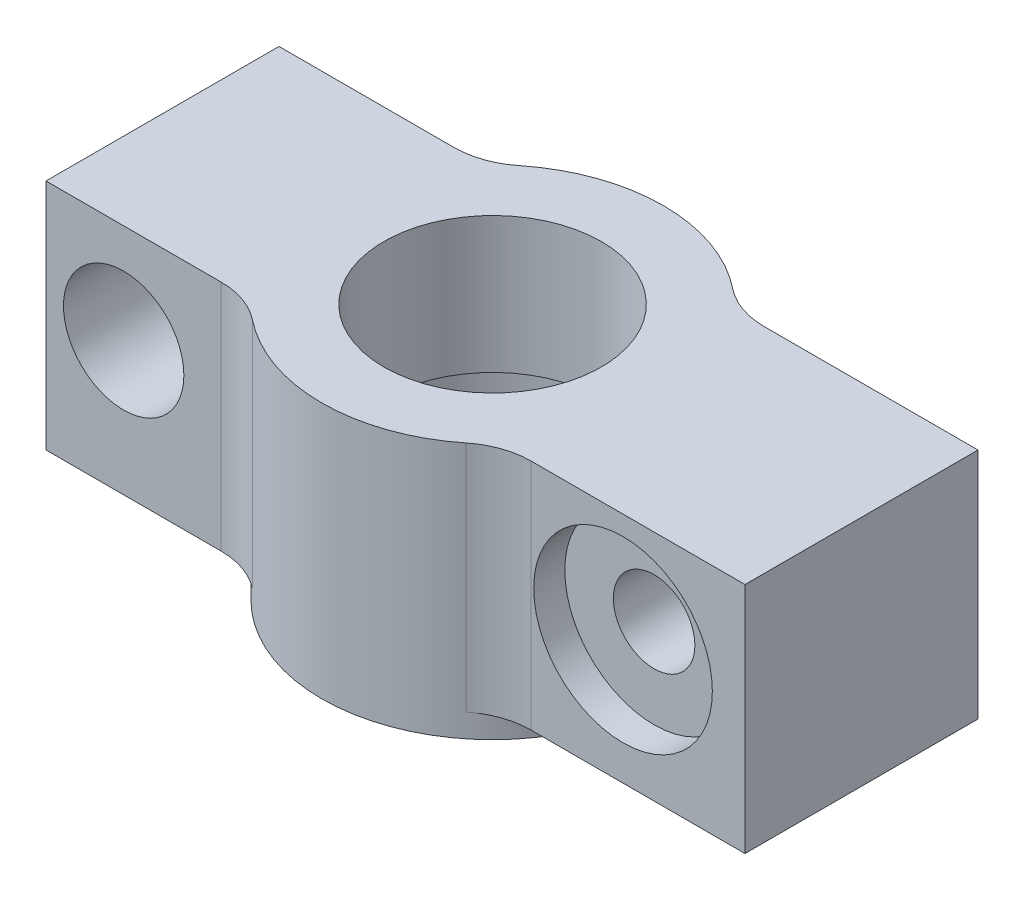
ISO-10303-21;
HEADER;
FILE_DESCRIPTION(('STEP AP214'),'2;1');
FILE_NAME('part.step','',(''),(''),'','','');
FILE_SCHEMA(('AUTOMOTIVE_DESIGN { 1 0 10303 214 1 1 1 1 }'));
ENDSEC;
DATA;
#1=APPLICATION_CONTEXT('core data for automotive mechanical design processes');
#2=APPLICATION_PROTOCOL_DEFINITION('international standard','automotive_design',2000,#1);
#3=PRODUCT_CONTEXT('',#1,'mechanical');
#4=PRODUCT('Part','Part','',(#3));
#5=PRODUCT_RELATED_PRODUCT_CATEGORY('part','',(#4));
#6=PRODUCT_DEFINITION_FORMATION('','',#4);
#7=PRODUCT_DEFINITION_CONTEXT('part definition',#1,'design');
#8=PRODUCT_DEFINITION('design','',#6,#7);
#9=PRODUCT_DEFINITION_SHAPE('','',#8);
#10=(LENGTH_UNIT() NAMED_UNIT(*) SI_UNIT(.MILLI.,.METRE.));
#11=(NAMED_UNIT(*) PLANE_ANGLE_UNIT() SI_UNIT($,.RADIAN.));
#12=(NAMED_UNIT(*) SI_UNIT($,.STERADIAN.) SOLID_ANGLE_UNIT());
#13=UNCERTAINTY_MEASURE_WITH_UNIT(LENGTH_MEASURE(1.E-05),#10,'distance_accuracy_value','');
#14=(GEOMETRIC_REPRESENTATION_CONTEXT(3) GLOBAL_UNCERTAINTY_ASSIGNED_CONTEXT((#13)) GLOBAL_UNIT_ASSIGNED_CONTEXT((#10,
#11,#12)) REPRESENTATION_CONTEXT('',''));
#15=CARTESIAN_POINT('',(0.,0.,0.));
#16=DIRECTION('',(0.,0.,1.));
#17=DIRECTION('',(1.,0.,0.));
#18=AXIS2_PLACEMENT_3D('',#15,#16,#17);
#19=CARTESIAN_POINT('',(0.,0.,0.));
#20=DIRECTION('',(0.,1.,0.));
#21=DIRECTION('',(0.,0.,1.));
#22=AXIS2_PLACEMENT_3D('',#19,#20,#21);
#23=PLANE('',#22);
#24=CARTESIAN_POINT('',(0.,0.,0.));
#25=DIRECTION('',(0.,-1.,0.));
#26=DIRECTION('',(0.,0.,-1.));
#27=AXIS2_PLACEMENT_3D('',#24,#25,#26);
#28=CIRCLE('',#27,22.);
#29=CARTESIAN_POINT('',(13.7328017443638,0.,-17.1875));
#30=VERTEX_POINT('',#29);
#31=CARTESIAN_POINT('',(13.7328017443638,0.,17.1875));
#32=VERTEX_POINT('',#31);
#33=EDGE_CURVE('E198',#30,#32,#28,.T.);
#34=ORIENTED_EDGE('',*,*,#33,.F.);
#35=CARTESIAN_POINT('',(19.9749843554382,0.,-25.));
#36=DIRECTION('',(0.,1.,0.));
#37=DIRECTION('',(0.,0.,1.));
#38=AXIS2_PLACEMENT_3D('',#35,#36,#37);
#39=CIRCLE('',#38,10.);
#40=CARTESIAN_POINT('',(19.9749843554382,0.,-15.));
#41=VERTEX_POINT('',#40);
#42=EDGE_CURVE('E333',#30,#41,#39,.T.);
#43=ORIENTED_EDGE('',*,*,#42,.T.);
#44=DIRECTION('',(-1.,0.,0.));
#45=VECTOR('',#44,1.);
#46=CARTESIAN_POINT('',(16.0934769394311,0.,-15.));
#47=LINE('',#46,#45);
#48=CARTESIAN_POINT('',(47.5,0.,-15.));
#49=VERTEX_POINT('',#48);
#50=EDGE_CURVE('E279',#49,#41,#47,.T.);
#51=ORIENTED_EDGE('',*,*,#50,.F.);
#52=DIRECTION('',(0.,0.,-1.));
#53=VECTOR('',#52,1.);
#54=CARTESIAN_POINT('',(47.5,0.,-15.));
#55=LINE('',#54,#53);
#56=CARTESIAN_POINT('',(47.5,0.,15.));
#57=VERTEX_POINT('',#56);
#58=EDGE_CURVE('E276',#57,#49,#55,.T.);
#59=ORIENTED_EDGE('',*,*,#58,.F.);
#60=DIRECTION('',(1.,0.,0.));
#61=VECTOR('',#60,1.);
#62=CARTESIAN_POINT('',(16.0934769394311,0.,15.));
#63=LINE('',#62,#61);
#64=CARTESIAN_POINT('',(19.9749843554382,0.,15.));
#65=VERTEX_POINT('',#64);
#66=EDGE_CURVE('E273',#65,#57,#63,.T.);
#67=ORIENTED_EDGE('',*,*,#66,.F.);
#68=CARTESIAN_POINT('',(19.9749843554382,0.,25.));
#69=DIRECTION('',(0.,1.,0.));
#70=DIRECTION('',(0.,0.,1.));
#71=AXIS2_PLACEMENT_3D('',#68,#69,#70);
#72=CIRCLE('',#71,10.);
#73=EDGE_CURVE('E352',#65,#32,#72,.T.);
#74=ORIENTED_EDGE('',*,*,#73,.T.);
#75=EDGE_LOOP('',(#34,#43,#51,#59,#67,#74));
#76=FACE_BOUND('',#75,.T.);
#77=ADVANCED_FACE('F43',(#76),#23,.F.);
#78=CARTESIAN_POINT('',(-13.7328017443637,0.,17.1875));
#79=VERTEX_POINT('',#78);
#80=CARTESIAN_POINT('',(-13.7328017443637,0.,-17.1875));
#81=VERTEX_POINT('',#80);
#82=EDGE_CURVE('E210',#79,#81,#28,.T.);
#83=ORIENTED_EDGE('',*,*,#82,.F.);
#84=CARTESIAN_POINT('',(-19.9749843554382,0.,25.));
#85=DIRECTION('',(0.,1.,0.));
#86=DIRECTION('',(0.,0.,1.));
#87=AXIS2_PLACEMENT_3D('',#84,#85,#86);
#88=CIRCLE('',#87,10.);
#89=CARTESIAN_POINT('',(-19.9749843554382,0.,15.));
#90=VERTEX_POINT('',#89);
#91=EDGE_CURVE('E346',#79,#90,#88,.T.);
#92=ORIENTED_EDGE('',*,*,#91,.T.);
#93=DIRECTION('',(1.,0.,0.));
#94=VECTOR('',#93,1.);
#95=CARTESIAN_POINT('',(-47.5,0.,15.));
#96=LINE('',#95,#94);
#97=CARTESIAN_POINT('',(-42.5,0.,15.));
#98=VERTEX_POINT('',#97);
#99=EDGE_CURVE('E286',#98,#90,#96,.T.);
#100=ORIENTED_EDGE('',*,*,#99,.F.);
#101=DIRECTION('',(0.,0.,-1.));
#102=VECTOR('',#101,1.);
#103=CARTESIAN_POINT('',(-42.5,0.,0.));
#104=LINE('',#103,#102);
#105=CARTESIAN_POINT('',(-42.5,0.,-15.));
#106=VERTEX_POINT('',#105);
#107=EDGE_CURVE('E298',#98,#106,#104,.T.);
#108=ORIENTED_EDGE('',*,*,#107,.T.);
#109=DIRECTION('',(-1.,0.,0.));
#110=VECTOR('',#109,1.);
#111=CARTESIAN_POINT('',(-47.5,0.,-15.));
#112=LINE('',#111,#110);
#113=CARTESIAN_POINT('',(-19.9749843554382,0.,-15.));
#114=VERTEX_POINT('',#113);
#115=EDGE_CURVE('E283',#114,#106,#112,.T.);
#116=ORIENTED_EDGE('',*,*,#115,.F.);
#117=CARTESIAN_POINT('',(-19.9749843554382,0.,-25.));
#118=DIRECTION('',(0.,1.,0.));
#119=DIRECTION('',(0.,0.,1.));
#120=AXIS2_PLACEMENT_3D('',#117,#118,#119);
#121=CIRCLE('',#120,10.);
#122=EDGE_CURVE('E339',#114,#81,#121,.T.);
#123=ORIENTED_EDGE('',*,*,#122,.T.);
#124=EDGE_LOOP('',(#83,#92,#100,#108,#116,#123));
#125=FACE_BOUND('',#124,.T.);
#126=ADVANCED_FACE('F388',(#125),#23,.F.);
#127=CARTESIAN_POINT('',(0.,3.,0.));
#128=DIRECTION('',(0.,-1.,0.));
#129=DIRECTION('',(0.,0.,-1.));
#130=AXIS2_PLACEMENT_3D('',#127,#128,#129);
#131=CYLINDRICAL_SURFACE('',#130,22.);
#132=CARTESIAN_POINT('',(0.,30.,0.));
#133=DIRECTION('',(0.,1.,0.));
#134=DIRECTION('',(0.,0.,1.));
#135=AXIS2_PLACEMENT_3D('',#132,#133,#134);
#136=CIRCLE('',#135,22.);
#137=CARTESIAN_POINT('',(-13.7328017443637,30.,17.1875));
#138=VERTEX_POINT('',#137);
#139=CARTESIAN_POINT('',(13.7328017443638,30.,17.1875));
#140=VERTEX_POINT('',#139);
#141=EDGE_CURVE('E221',#138,#140,#136,.T.);
#142=ORIENTED_EDGE('',*,*,#141,.F.);
#143=DIRECTION('',(0.,-1.,0.));
#144=VECTOR('',#143,1.);
#145=CARTESIAN_POINT('',(-13.7328017443637,3.,17.1875));
#146=LINE('',#145,#144);
#147=EDGE_CURVE('E322',#138,#79,#146,.T.);
#148=ORIENTED_EDGE('',*,*,#147,.T.);
#149=ORIENTED_EDGE('',*,*,#82,.T.);
#150=DIRECTION('',(0.,-1.,0.));
#151=VECTOR('',#150,1.);
#152=CARTESIAN_POINT('',(-13.7328017443637,3.,-17.1875));
#153=LINE('',#152,#151);
#154=CARTESIAN_POINT('',(-13.7328017443637,30.,-17.1875));
#155=VERTEX_POINT('',#154);
#156=EDGE_CURVE('E305',#81,#155,#153,.F.);
#157=ORIENTED_EDGE('',*,*,#156,.T.);
#158=CARTESIAN_POINT('',(13.7328017443638,30.,-17.1875));
#159=VERTEX_POINT('',#158);
#160=EDGE_CURVE('E225',#159,#155,#136,.T.);
#161=ORIENTED_EDGE('',*,*,#160,.F.);
#162=DIRECTION('',(0.,-1.,0.));
#163=VECTOR('',#162,1.);
#164=CARTESIAN_POINT('',(13.7328017443638,3.,-17.1875));
#165=LINE('',#164,#163);
#166=EDGE_CURVE('E308',#159,#30,#165,.T.);
#167=ORIENTED_EDGE('',*,*,#166,.T.);
#168=ORIENTED_EDGE('',*,*,#33,.T.);
#169=DIRECTION('',(0.,-1.,0.));
#170=VECTOR('',#169,1.);
#171=CARTESIAN_POINT('',(13.7328017443638,3.,17.1875));
#172=LINE('',#171,#170);
#173=EDGE_CURVE('E319',#32,#140,#172,.F.);
#174=ORIENTED_EDGE('',*,*,#173,.T.);
#175=EDGE_LOOP('',(#142,#148,#149,#157,#161,#167,#168,#174));
#176=FACE_BOUND('',#175,.T.);
#177=CARTESIAN_POINT('',(0.,-3.,0.));
#178=DIRECTION('',(0.,-1.,0.));
#179=DIRECTION('',(0.,0.,-1.));
#180=AXIS2_PLACEMENT_3D('',#177,#178,#179);
#181=CIRCLE('',#180,22.);
#182=CARTESIAN_POINT('',(0.,-3.,-22.));
#183=VERTEX_POINT('',#182);
#184=EDGE_CURVE('E203',#183,#183,#181,.T.);
#185=ORIENTED_EDGE('',*,*,#184,.F.);
#186=EDGE_LOOP('',(#185));
#187=FACE_BOUND('',#186,.T.);
#188=ADVANCED_FACE('F385',(#176,#187),#131,.T.);
#189=CARTESIAN_POINT('',(31.7967384697156,16.,-33.));
#190=DIRECTION('',(0.,0.,1.));
#191=DIRECTION('',(1.,0.,0.));
#192=AXIS2_PLACEMENT_3D('',#189,#190,#191);
#193=CYLINDRICAL_SURFACE('',#192,5.25);
#194=CARTESIAN_POINT('',(31.7967384697156,16.,11.));
#195=DIRECTION('',(0.,0.,1.));
#196=DIRECTION('',(1.,0.,0.));
#197=AXIS2_PLACEMENT_3D('',#194,#195,#196);
#198=CIRCLE('',#197,5.25);
#199=CARTESIAN_POINT('',(37.0467384697156,16.,11.));
#200=VERTEX_POINT('',#199);
#201=EDGE_CURVE('E235',#200,#200,#198,.T.);
#202=ORIENTED_EDGE('',*,*,#201,.T.);
#203=EDGE_LOOP('',(#202));
#204=FACE_BOUND('',#203,.T.);
#205=CARTESIAN_POINT('',(31.7967384697156,16.,-11.));
#206=DIRECTION('',(0.,0.,-1.));
#207=DIRECTION('',(-1.,0.,0.));
#208=AXIS2_PLACEMENT_3D('',#205,#206,#207);
#209=CIRCLE('',#208,5.25);
#210=CARTESIAN_POINT('',(26.5467384697156,16.,-11.));
#211=VERTEX_POINT('',#210);
#212=EDGE_CURVE('E230',#211,#211,#209,.F.);
#213=ORIENTED_EDGE('',*,*,#212,.F.);
#214=EDGE_LOOP('',(#213));
#215=FACE_BOUND('',#214,.T.);
#216=ADVANCED_FACE('F387',(#204,#215),#193,.F.);
#217=CARTESIAN_POINT('',(16.0934769394311,3.,15.));
#218=DIRECTION('',(0.,0.,-1.));
#219=DIRECTION('',(-1.,0.,0.));
#220=AXIS2_PLACEMENT_3D('',#217,#218,#219);
#221=PLANE('',#220);
#222=CARTESIAN_POINT('',(31.7967384697156,16.,15.));
#223=DIRECTION('',(0.,0.,1.));
#224=DIRECTION('',(1.,0.,0.));
#225=AXIS2_PLACEMENT_3D('',#222,#223,#224);
#226=CIRCLE('',#225,11.5);
#227=CARTESIAN_POINT('',(43.2967384697156,16.,15.));
#228=VERTEX_POINT('',#227);
#229=EDGE_CURVE('E239',#228,#228,#226,.T.);
#230=ORIENTED_EDGE('',*,*,#229,.F.);
#231=EDGE_LOOP('',(#230));
#232=FACE_BOUND('',#231,.T.);
#233=DIRECTION('',(1.,0.,0.));
#234=VECTOR('',#233,1.);
#235=CARTESIAN_POINT('',(47.5,30.,15.));
#236=LINE('',#235,#234);
#237=CARTESIAN_POINT('',(19.9749843554382,30.,15.));
#238=VERTEX_POINT('',#237);
#239=CARTESIAN_POINT('',(47.5,30.,15.));
#240=VERTEX_POINT('',#239);
#241=EDGE_CURVE('E244',#238,#240,#236,.T.);
#242=ORIENTED_EDGE('',*,*,#241,.F.);
#243=DIRECTION('',(0.,1.,0.));
#244=VECTOR('',#243,1.);
#245=CARTESIAN_POINT('',(19.9749843554382,0.,15.));
#246=LINE('',#245,#244);
#247=EDGE_CURVE('E329',#238,#65,#246,.F.);
#248=ORIENTED_EDGE('',*,*,#247,.T.);
#249=ORIENTED_EDGE('',*,*,#66,.T.);
#250=DIRECTION('',(0.,-1.,0.));
#251=VECTOR('',#250,1.);
#252=CARTESIAN_POINT('',(47.5,3.,15.));
#253=LINE('',#252,#251);
#254=EDGE_CURVE('E294',#240,#57,#253,.T.);
#255=ORIENTED_EDGE('',*,*,#254,.F.);
#256=EDGE_LOOP('',(#242,#248,#249,#255));
#257=FACE_BOUND('',#256,.T.);
#258=ADVANCED_FACE('F395',(#232,#257),#221,.F.);
#259=CARTESIAN_POINT('',(47.5,3.,-15.));
#260=DIRECTION('',(-1.,0.,0.));
#261=DIRECTION('',(0.,0.,1.));
#262=AXIS2_PLACEMENT_3D('',#259,#260,#261);
#263=PLANE('',#262);
#264=ORIENTED_EDGE('',*,*,#58,.T.);
#265=DIRECTION('',(0.,-1.,0.));
#266=VECTOR('',#265,1.);
#267=CARTESIAN_POINT('',(47.5,3.,-15.));
#268=LINE('',#267,#266);
#269=CARTESIAN_POINT('',(47.5,30.,-15.));
#270=VERTEX_POINT('',#269);
#271=EDGE_CURVE('E290',#270,#49,#268,.T.);
#272=ORIENTED_EDGE('',*,*,#271,.F.);
#273=DIRECTION('',(0.,0.,-1.));
#274=VECTOR('',#273,1.);
#275=CARTESIAN_POINT('',(47.5,30.,-15.));
#276=LINE('',#275,#274);
#277=EDGE_CURVE('E250',#240,#270,#276,.T.);
#278=ORIENTED_EDGE('',*,*,#277,.F.);
#279=ORIENTED_EDGE('',*,*,#254,.T.);
#280=EDGE_LOOP('',(#264,#272,#278,#279));
#281=FACE_BOUND('',#280,.T.);
#282=ADVANCED_FACE('F595',(#281),#263,.F.);
#283=CARTESIAN_POINT('',(16.0934769394311,3.,-15.));
#284=DIRECTION('',(0.,0.,1.));
#285=DIRECTION('',(1.,0.,0.));
#286=AXIS2_PLACEMENT_3D('',#283,#284,#285);
#287=PLANE('',#286);
#288=CARTESIAN_POINT('',(31.7967384697156,16.,-15.));
#289=DIRECTION('',(0.,0.,-1.));
#290=DIRECTION('',(-1.,0.,0.));
#291=AXIS2_PLACEMENT_3D('',#288,#289,#290);
#292=CIRCLE('',#291,11.5);
#293=CARTESIAN_POINT('',(20.2967384697156,16.,-15.));
#294=VERTEX_POINT('',#293);
#295=EDGE_CURVE('E231',#294,#294,#292,.T.);
#296=ORIENTED_EDGE('',*,*,#295,.F.);
#297=EDGE_LOOP('',(#296));
#298=FACE_BOUND('',#297,.T.);
#299=ORIENTED_EDGE('',*,*,#50,.T.);
#300=DIRECTION('',(0.,1.,0.));
#301=VECTOR('',#300,1.);
#302=CARTESIAN_POINT('',(19.9749843554382,30.,-15.));
#303=LINE('',#302,#301);
#304=CARTESIAN_POINT('',(19.9749843554382,30.,-15.));
#305=VERTEX_POINT('',#304);
#306=EDGE_CURVE('E312',#41,#305,#303,.T.);
#307=ORIENTED_EDGE('',*,*,#306,.T.);
#308=DIRECTION('',(-1.,0.,0.));
#309=VECTOR('',#308,1.);
#310=CARTESIAN_POINT('',(16.0934769394311,30.,-15.));
#311=LINE('',#310,#309);
#312=EDGE_CURVE('E254',#270,#305,#311,.T.);
#313=ORIENTED_EDGE('',*,*,#312,.F.);
#314=ORIENTED_EDGE('',*,*,#271,.T.);
#315=EDGE_LOOP('',(#299,#307,#313,#314));
#316=FACE_BOUND('',#315,.T.);
#317=ADVANCED_FACE('F583',(#298,#316),#287,.F.);
#318=CARTESIAN_POINT('',(-47.5,3.,-15.));
#319=DIRECTION('',(0.,0.,1.));
#320=DIRECTION('',(1.,0.,0.));
#321=AXIS2_PLACEMENT_3D('',#318,#319,#320);
#322=PLANE('',#321);
#323=DIRECTION('',(-1.,0.,0.));
#324=VECTOR('',#323,1.);
#325=CARTESIAN_POINT('',(-22.5,30.,-15.));
#326=LINE('',#325,#324);
#327=CARTESIAN_POINT('',(-19.9749843554382,30.,-15.));
#328=VERTEX_POINT('',#327);
#329=CARTESIAN_POINT('',(-42.5,30.,-15.));
#330=VERTEX_POINT('',#329);
#331=EDGE_CURVE('E214',#328,#330,#326,.T.);
#332=ORIENTED_EDGE('',*,*,#331,.F.);
#333=DIRECTION('',(0.,1.,0.));
#334=VECTOR('',#333,1.);
#335=CARTESIAN_POINT('',(-19.9749843554382,0.,-15.));
#336=LINE('',#335,#334);
#337=EDGE_CURVE('E315',#328,#114,#336,.F.);
#338=ORIENTED_EDGE('',*,*,#337,.T.);
#339=ORIENTED_EDGE('',*,*,#115,.T.);
#340=DIRECTION('',(0.,-1.,0.));
#341=VECTOR('',#340,1.);
#342=CARTESIAN_POINT('',(-42.5,29.,-15.));
#343=LINE('',#342,#341);
#344=EDGE_CURVE('E266',#330,#106,#343,.T.);
#345=ORIENTED_EDGE('',*,*,#344,.F.);
#346=EDGE_LOOP('',(#332,#338,#339,#345));
#347=FACE_BOUND('',#346,.T.);
#348=CARTESIAN_POINT('',(-32.5,17.2,-15.));
#349=DIRECTION('',(0.,0.,1.));
#350=DIRECTION('',(1.,0.,0.));
#351=AXIS2_PLACEMENT_3D('',#348,#349,#350);
#352=CIRCLE('',#351,7.75);
#353=CARTESIAN_POINT('',(-24.75,17.2,-15.));
#354=VERTEX_POINT('',#353);
#355=EDGE_CURVE('E262',#354,#354,#352,.T.);
#356=ORIENTED_EDGE('',*,*,#355,.T.);
#357=EDGE_LOOP('',(#356));
#358=FACE_BOUND('',#357,.T.);
#359=ADVANCED_FACE('F573',(#347,#358),#322,.F.);
#360=CARTESIAN_POINT('',(-47.5,3.,15.));
#361=DIRECTION('',(0.,0.,-1.));
#362=DIRECTION('',(-1.,0.,0.));
#363=AXIS2_PLACEMENT_3D('',#360,#361,#362);
#364=PLANE('',#363);
#365=ORIENTED_EDGE('',*,*,#99,.T.);
#366=DIRECTION('',(0.,1.,0.));
#367=VECTOR('',#366,1.);
#368=CARTESIAN_POINT('',(-19.9749843554382,30.,15.));
#369=LINE('',#368,#367);
#370=CARTESIAN_POINT('',(-19.9749843554382,30.,15.));
#371=VERTEX_POINT('',#370);
#372=EDGE_CURVE('E326',#90,#371,#369,.T.);
#373=ORIENTED_EDGE('',*,*,#372,.T.);
#374=DIRECTION('',(1.,0.,0.));
#375=VECTOR('',#374,1.);
#376=CARTESIAN_POINT('',(-16.0934769394311,30.,15.));
#377=LINE('',#376,#375);
#378=CARTESIAN_POINT('',(-42.5,30.,15.));
#379=VERTEX_POINT('',#378);
#380=EDGE_CURVE('E217',#379,#371,#377,.T.);
#381=ORIENTED_EDGE('',*,*,#380,.F.);
#382=DIRECTION('',(0.,-1.,0.));
#383=VECTOR('',#382,1.);
#384=CARTESIAN_POINT('',(-42.5,29.,15.));
#385=LINE('',#384,#383);
#386=EDGE_CURVE('E270',#379,#98,#385,.T.);
#387=ORIENTED_EDGE('',*,*,#386,.T.);
#388=EDGE_LOOP('',(#365,#373,#381,#387));
#389=FACE_BOUND('',#388,.T.);
#390=CARTESIAN_POINT('',(-32.5,17.2,15.));
#391=DIRECTION('',(0.,0.,1.));
#392=DIRECTION('',(1.,0.,0.));
#393=AXIS2_PLACEMENT_3D('',#390,#391,#392);
#394=CIRCLE('',#393,7.75);
#395=CARTESIAN_POINT('',(-24.75,17.2,15.));
#396=VERTEX_POINT('',#395);
#397=EDGE_CURVE('E258',#396,#396,#394,.T.);
#398=ORIENTED_EDGE('',*,*,#397,.F.);
#399=EDGE_LOOP('',(#398));
#400=FACE_BOUND('',#399,.T.);
#401=ADVANCED_FACE('F411',(#389,#400),#364,.F.);
#402=CARTESIAN_POINT('',(-42.5,29.,-15.));
#403=DIRECTION('',(1.,0.,0.));
#404=DIRECTION('',(0.,0.,-1.));
#405=AXIS2_PLACEMENT_3D('',#402,#403,#404);
#406=PLANE('',#405);
#407=ORIENTED_EDGE('',*,*,#344,.T.);
#408=ORIENTED_EDGE('',*,*,#107,.F.);
#409=ORIENTED_EDGE('',*,*,#386,.F.);
#410=DIRECTION('',(0.,0.,1.));
#411=VECTOR('',#410,1.);
#412=CARTESIAN_POINT('',(-42.5,30.,-15.));
#413=LINE('',#412,#411);
#414=EDGE_CURVE('E207',#330,#379,#413,.T.);
#415=ORIENTED_EDGE('',*,*,#414,.F.);
#416=EDGE_LOOP('',(#407,#408,#409,#415));
#417=FACE_BOUND('',#416,.T.);
#418=ADVANCED_FACE('F407',(#417),#406,.F.);
#419=CARTESIAN_POINT('',(-32.5,17.2,-21.));
#420=DIRECTION('',(0.,0.,1.));
#421=DIRECTION('',(1.,0.,0.));
#422=AXIS2_PLACEMENT_3D('',#419,#420,#421);
#423=CYLINDRICAL_SURFACE('',#422,7.75);
#424=ORIENTED_EDGE('',*,*,#397,.T.);
#425=EDGE_LOOP('',(#424));
#426=FACE_BOUND('',#425,.T.);
#427=ORIENTED_EDGE('',*,*,#355,.F.);
#428=EDGE_LOOP('',(#427));
#429=FACE_BOUND('',#428,.T.);
#430=ADVANCED_FACE('F410',(#426,#429),#423,.F.);
#431=CARTESIAN_POINT('',(0.,30.,0.));
#432=DIRECTION('',(0.,-1.,0.));
#433=DIRECTION('',(0.,0.,-1.));
#434=AXIS2_PLACEMENT_3D('',#431,#432,#433);
#435=PLANE('',#434);
#436=CARTESIAN_POINT('',(0.,30.,0.));
#437=DIRECTION('',(0.,-1.,0.));
#438=DIRECTION('',(0.,0.,-1.));
#439=AXIS2_PLACEMENT_3D('',#436,#437,#438);
#440=CIRCLE('',#439,14.);
#441=CARTESIAN_POINT('',(0.,30.,-14.));
#442=VERTEX_POINT('',#441);
#443=EDGE_CURVE('E194',#442,#442,#440,.T.);
#444=ORIENTED_EDGE('',*,*,#443,.T.);
#445=EDGE_LOOP('',(#444));
#446=FACE_BOUND('',#445,.T.);
#447=ORIENTED_EDGE('',*,*,#312,.T.);
#448=CARTESIAN_POINT('',(19.9749843554382,30.,-25.));
#449=DIRECTION('',(0.,-1.,0.));
#450=DIRECTION('',(0.,0.,-1.));
#451=AXIS2_PLACEMENT_3D('',#448,#449,#450);
#452=CIRCLE('',#451,10.);
#453=EDGE_CURVE('E336',#305,#159,#452,.T.);
#454=ORIENTED_EDGE('',*,*,#453,.T.);
#455=ORIENTED_EDGE('',*,*,#160,.T.);
#456=CARTESIAN_POINT('',(-19.9749843554382,30.,-25.));
#457=DIRECTION('',(0.,-1.,0.));
#458=DIRECTION('',(0.,0.,-1.));
#459=AXIS2_PLACEMENT_3D('',#456,#457,#458);
#460=CIRCLE('',#459,10.);
#461=EDGE_CURVE('E343',#155,#328,#460,.T.);
#462=ORIENTED_EDGE('',*,*,#461,.T.);
#463=ORIENTED_EDGE('',*,*,#331,.T.);
#464=ORIENTED_EDGE('',*,*,#414,.T.);
#465=ORIENTED_EDGE('',*,*,#380,.T.);
#466=CARTESIAN_POINT('',(-19.9749843554382,30.,25.));
#467=DIRECTION('',(0.,-1.,0.));
#468=DIRECTION('',(0.,0.,-1.));
#469=AXIS2_PLACEMENT_3D('',#466,#467,#468);
#470=CIRCLE('',#469,10.);
#471=EDGE_CURVE('E349',#371,#138,#470,.T.);
#472=ORIENTED_EDGE('',*,*,#471,.T.);
#473=ORIENTED_EDGE('',*,*,#141,.T.);
#474=CARTESIAN_POINT('',(19.9749843554382,30.,25.));
#475=DIRECTION('',(0.,-1.,0.));
#476=DIRECTION('',(0.,0.,-1.));
#477=AXIS2_PLACEMENT_3D('',#474,#475,#476);
#478=CIRCLE('',#477,10.);
#479=EDGE_CURVE('E356',#140,#238,#478,.T.);
#480=ORIENTED_EDGE('',*,*,#479,.T.);
#481=ORIENTED_EDGE('',*,*,#241,.T.);
#482=ORIENTED_EDGE('',*,*,#277,.T.);
#483=EDGE_LOOP('',(#447,#454,#455,#462,#463,#464,#465,#472,#473,#480,#481,#482));
#484=FACE_BOUND('',#483,.T.);
#485=ADVANCED_FACE('F415',(#446,#484),#435,.F.);
#486=CARTESIAN_POINT('',(31.7967384697156,16.,11.));
#487=DIRECTION('',(0.,0.,1.));
#488=DIRECTION('',(1.,0.,0.));
#489=AXIS2_PLACEMENT_3D('',#486,#487,#488);
#490=CYLINDRICAL_SURFACE('',#489,11.5);
#491=CARTESIAN_POINT('',(31.7967384697156,16.,11.));
#492=DIRECTION('',(0.,0.,1.));
#493=DIRECTION('',(1.,0.,0.));
#494=AXIS2_PLACEMENT_3D('',#491,#492,#493);
#495=CIRCLE('',#494,11.5);
#496=CARTESIAN_POINT('',(43.2967384697156,16.,11.));
#497=VERTEX_POINT('',#496);
#498=EDGE_CURVE('E240',#497,#497,#495,.T.);
#499=ORIENTED_EDGE('',*,*,#498,.F.);
#500=EDGE_LOOP('',(#499));
#501=FACE_BOUND('',#500,.T.);
#502=ORIENTED_EDGE('',*,*,#229,.T.);
#503=EDGE_LOOP('',(#502));
#504=FACE_BOUND('',#503,.T.);
#505=ADVANCED_FACE('F419',(#501,#504),#490,.F.);
#506=CARTESIAN_POINT('',(31.7967384697156,16.,11.));
#507=DIRECTION('',(0.,0.,1.));
#508=DIRECTION('',(1.,0.,0.));
#509=AXIS2_PLACEMENT_3D('',#506,#507,#508);
#510=PLANE('',#509);
#511=ORIENTED_EDGE('',*,*,#201,.F.);
#512=EDGE_LOOP('',(#511));
#513=FACE_BOUND('',#512,.T.);
#514=ORIENTED_EDGE('',*,*,#498,.T.);
#515=EDGE_LOOP('',(#514));
#516=FACE_BOUND('',#515,.T.);
#517=ADVANCED_FACE('F423',(#513,#516),#510,.T.);
#518=CARTESIAN_POINT('',(31.7967384697156,16.,-11.));
#519=DIRECTION('',(0.,0.,-1.));
#520=DIRECTION('',(-1.,0.,0.));
#521=AXIS2_PLACEMENT_3D('',#518,#519,#520);
#522=PLANE('',#521);
#523=CARTESIAN_POINT('',(31.7967384697156,16.,-11.));
#524=DIRECTION('',(0.,0.,-1.));
#525=DIRECTION('',(-1.,0.,0.));
#526=AXIS2_PLACEMENT_3D('',#523,#524,#525);
#527=CIRCLE('',#526,11.5);
#528=CARTESIAN_POINT('',(20.2967384697156,16.,-11.));
#529=VERTEX_POINT('',#528);
#530=EDGE_CURVE('E226',#529,#529,#527,.T.);
#531=ORIENTED_EDGE('',*,*,#530,.T.);
#532=EDGE_LOOP('',(#531));
#533=FACE_BOUND('',#532,.T.);
#534=ORIENTED_EDGE('',*,*,#212,.T.);
#535=EDGE_LOOP('',(#534));
#536=FACE_BOUND('',#535,.T.);
#537=ADVANCED_FACE('F426',(#533,#536),#522,.T.);
#538=CARTESIAN_POINT('',(31.7967384697156,16.,-11.));
#539=DIRECTION('',(0.,0.,-1.));
#540=DIRECTION('',(-1.,0.,0.));
#541=AXIS2_PLACEMENT_3D('',#538,#539,#540);
#542=CYLINDRICAL_SURFACE('',#541,11.5);
#543=ORIENTED_EDGE('',*,*,#530,.F.);
#544=EDGE_LOOP('',(#543));
#545=FACE_BOUND('',#544,.T.);
#546=ORIENTED_EDGE('',*,*,#295,.T.);
#547=EDGE_LOOP('',(#546));
#548=FACE_BOUND('',#547,.T.);
#549=ADVANCED_FACE('F429',(#545,#548),#542,.F.);
#550=CARTESIAN_POINT('',(19.9749843554382,3.,-25.));
#551=DIRECTION('',(0.,-1.,0.));
#552=DIRECTION('',(0.,0.,-1.));
#553=AXIS2_PLACEMENT_3D('',#550,#551,#552);
#554=CYLINDRICAL_SURFACE('',#553,10.);
#555=ORIENTED_EDGE('',*,*,#453,.F.);
#556=ORIENTED_EDGE('',*,*,#306,.F.);
#557=ORIENTED_EDGE('',*,*,#42,.F.);
#558=ORIENTED_EDGE('',*,*,#166,.F.);
#559=EDGE_LOOP('',(#555,#556,#557,#558));
#560=FACE_BOUND('',#559,.T.);
#561=ADVANCED_FACE('F432',(#560),#554,.F.);
#562=CARTESIAN_POINT('',(-19.9749843554382,3.,-25.));
#563=DIRECTION('',(0.,-1.,0.));
#564=DIRECTION('',(0.,0.,-1.));
#565=AXIS2_PLACEMENT_3D('',#562,#563,#564);
#566=CYLINDRICAL_SURFACE('',#565,10.);
#567=ORIENTED_EDGE('',*,*,#461,.F.);
#568=ORIENTED_EDGE('',*,*,#156,.F.);
#569=ORIENTED_EDGE('',*,*,#122,.F.);
#570=ORIENTED_EDGE('',*,*,#337,.F.);
#571=EDGE_LOOP('',(#567,#568,#569,#570));
#572=FACE_BOUND('',#571,.T.);
#573=ADVANCED_FACE('F530',(#572),#566,.F.);
#574=CARTESIAN_POINT('',(-19.9749843554382,3.,25.));
#575=DIRECTION('',(0.,-1.,0.));
#576=DIRECTION('',(0.,0.,-1.));
#577=AXIS2_PLACEMENT_3D('',#574,#575,#576);
#578=CYLINDRICAL_SURFACE('',#577,10.);
#579=ORIENTED_EDGE('',*,*,#471,.F.);
#580=ORIENTED_EDGE('',*,*,#372,.F.);
#581=ORIENTED_EDGE('',*,*,#91,.F.);
#582=ORIENTED_EDGE('',*,*,#147,.F.);
#583=EDGE_LOOP('',(#579,#580,#581,#582));
#584=FACE_BOUND('',#583,.T.);
#585=ADVANCED_FACE('F522',(#584),#578,.F.);
#586=CARTESIAN_POINT('',(19.9749843554382,3.,25.));
#587=DIRECTION('',(0.,-1.,0.));
#588=DIRECTION('',(0.,0.,-1.));
#589=AXIS2_PLACEMENT_3D('',#586,#587,#588);
#590=CYLINDRICAL_SURFACE('',#589,10.);
#591=ORIENTED_EDGE('',*,*,#479,.F.);
#592=ORIENTED_EDGE('',*,*,#173,.F.);
#593=ORIENTED_EDGE('',*,*,#73,.F.);
#594=ORIENTED_EDGE('',*,*,#247,.F.);
#595=EDGE_LOOP('',(#591,#592,#593,#594));
#596=FACE_BOUND('',#595,.T.);
#597=ADVANCED_FACE('F45',(#596),#590,.F.);
#598=CARTESIAN_POINT('',(0.,-3.,0.));
#599=DIRECTION('',(0.,-1.,0.));
#600=DIRECTION('',(0.,0.,-1.));
#601=AXIS2_PLACEMENT_3D('',#598,#599,#600);
#602=PLANE('',#601);
#603=CARTESIAN_POINT('',(0.,-3.,0.));
#604=DIRECTION('',(0.,-1.,0.));
#605=DIRECTION('',(0.,0.,-1.));
#606=AXIS2_PLACEMENT_3D('',#603,#604,#605);
#607=CIRCLE('',#606,16.9);
#608=CARTESIAN_POINT('',(0.,-3.,-16.9));
#609=VERTEX_POINT('',#608);
#610=EDGE_CURVE('E199',#609,#609,#607,.T.);
#611=ORIENTED_EDGE('',*,*,#610,.F.);
#612=EDGE_LOOP('',(#611));
#613=FACE_BOUND('',#612,.T.);
#614=ORIENTED_EDGE('',*,*,#184,.T.);
#615=EDGE_LOOP('',(#614));
#616=FACE_BOUND('',#615,.T.);
#617=ADVANCED_FACE('F376',(#613,#616),#602,.T.);
#618=CARTESIAN_POINT('',(0.,12.5,0.));
#619=DIRECTION('',(0.,-1.,0.));
#620=DIRECTION('',(0.,0.,-1.));
#621=AXIS2_PLACEMENT_3D('',#618,#619,#620);
#622=CYLINDRICAL_SURFACE('',#621,16.9);
#623=CARTESIAN_POINT('',(0.,12.5,0.));
#624=DIRECTION('',(0.,-1.,0.));
#625=DIRECTION('',(0.,0.,-1.));
#626=AXIS2_PLACEMENT_3D('',#623,#624,#625);
#627=CIRCLE('',#626,16.9);
#628=CARTESIAN_POINT('',(16.7140659326209,12.5,2.5));
#629=VERTEX_POINT('',#628);
#630=CARTESIAN_POINT('',(16.7140659326209,12.5,-2.5));
#631=VERTEX_POINT('',#630);
#632=EDGE_CURVE('E195',#629,#631,#627,.T.);
#633=ORIENTED_EDGE('',*,*,#632,.F.);
#634=DIRECTION('',(0.,-1.,0.));
#635=VECTOR('',#634,1.);
#636=CARTESIAN_POINT('',(16.7140659326209,12.5,2.5));
#637=LINE('',#636,#635);
#638=CARTESIAN_POINT('',(16.7140659326209,10.,2.5));
#639=VERTEX_POINT('',#638);
#640=EDGE_CURVE('E59',#629,#639,#637,.T.);
#641=ORIENTED_EDGE('',*,*,#640,.T.);
#642=CARTESIAN_POINT('',(0.,10.,0.));
#643=DIRECTION('',(0.,1.,0.));
#644=DIRECTION('',(0.,0.,1.));
#645=AXIS2_PLACEMENT_3D('',#642,#643,#644);
#646=CIRCLE('',#645,16.9);
#647=CARTESIAN_POINT('',(16.7140659326209,10.,-2.5));
#648=VERTEX_POINT('',#647);
#649=EDGE_CURVE('E11',#648,#639,#646,.F.);
#650=ORIENTED_EDGE('',*,*,#649,.F.);
#651=DIRECTION('',(0.,-1.,0.));
#652=VECTOR('',#651,1.);
#653=CARTESIAN_POINT('',(16.7140659326209,12.5,-2.5));
#654=LINE('',#653,#652);
#655=EDGE_CURVE('E160',#648,#631,#654,.F.);
#656=ORIENTED_EDGE('',*,*,#655,.T.);
#657=EDGE_LOOP('',(#633,#641,#650,#656));
#658=FACE_BOUND('',#657,.T.);
#659=ORIENTED_EDGE('',*,*,#610,.T.);
#660=EDGE_LOOP('',(#659));
#661=FACE_BOUND('',#660,.T.);
#662=ADVANCED_FACE('F373',(#658,#661),#622,.F.);
#663=CARTESIAN_POINT('',(0.,12.5,0.));
#664=DIRECTION('',(0.,-1.,0.));
#665=DIRECTION('',(0.,0.,-1.));
#666=AXIS2_PLACEMENT_3D('',#663,#664,#665);
#667=PLANE('',#666);
#668=DIRECTION('',(-1.,0.,0.));
#669=VECTOR('',#668,1.);
#670=CARTESIAN_POINT('',(0.,12.5,2.5));
#671=LINE('',#670,#669);
#672=CARTESIAN_POINT('',(14.030024385419,12.5,2.5));
#673=VERTEX_POINT('',#672);
#674=EDGE_CURVE('E52',#629,#673,#671,.T.);
#675=ORIENTED_EDGE('',*,*,#674,.F.);
#676=ORIENTED_EDGE('',*,*,#632,.T.);
#677=DIRECTION('',(1.,0.,0.));
#678=VECTOR('',#677,1.);
#679=CARTESIAN_POINT('',(0.,12.5,-2.5));
#680=LINE('',#679,#678);
#681=CARTESIAN_POINT('',(14.030024385419,12.5,-2.5));
#682=VERTEX_POINT('',#681);
#683=EDGE_CURVE('E362',#682,#631,#680,.T.);
#684=ORIENTED_EDGE('',*,*,#683,.F.);
#685=DIRECTION('',(0.,0.,-1.));
#686=VECTOR('',#685,1.);
#687=CARTESIAN_POINT('',(14.030024385419,12.5,0.));
#688=LINE('',#687,#686);
#689=EDGE_CURVE('E172',#673,#682,#688,.T.);
#690=ORIENTED_EDGE('',*,*,#689,.F.);
#691=EDGE_LOOP('',(#675,#676,#684,#690));
#692=FACE_BOUND('',#691,.T.);
#693=CARTESIAN_POINT('',(0.,12.5,0.));
#694=DIRECTION('',(0.,-1.,0.));
#695=DIRECTION('',(0.,0.,-1.));
#696=AXIS2_PLACEMENT_3D('',#693,#694,#695);
#697=CIRCLE('',#696,14.);
#698=CARTESIAN_POINT('',(0.,12.5,-14.));
#699=VERTEX_POINT('',#698);
#700=EDGE_CURVE('E190',#699,#699,#697,.T.);
#701=ORIENTED_EDGE('',*,*,#700,.F.);
#702=EDGE_LOOP('',(#701));
#703=FACE_BOUND('',#702,.T.);
#704=ADVANCED_FACE('F371',(#692,#703),#667,.T.);
#705=CARTESIAN_POINT('',(0.,38.,0.));
#706=DIRECTION('',(0.,-1.,0.));
#707=DIRECTION('',(0.,0.,-1.));
#708=AXIS2_PLACEMENT_3D('',#705,#706,#707);
#709=CYLINDRICAL_SURFACE('',#708,14.);
#710=ORIENTED_EDGE('',*,*,#700,.T.);
#711=EDGE_LOOP('',(#710));
#712=FACE_BOUND('',#711,.T.);
#713=ORIENTED_EDGE('',*,*,#443,.F.);
#714=EDGE_LOOP('',(#713));
#715=FACE_BOUND('',#714,.T.);
#716=ADVANCED_FACE('F439',(#712,#715),#709,.F.);
#717=CARTESIAN_POINT('',(0.,10.,0.));
#718=DIRECTION('',(0.,1.,0.));
#719=DIRECTION('',(0.,0.,1.));
#720=AXIS2_PLACEMENT_3D('',#717,#718,#719);
#721=PLANE('',#720);
#722=DIRECTION('',(-1.,0.,0.));
#723=VECTOR('',#722,1.);
#724=CARTESIAN_POINT('',(14.030024385419,10.,-2.5));
#725=LINE('',#724,#723);
#726=CARTESIAN_POINT('',(14.030024385419,10.,-2.5));
#727=VERTEX_POINT('',#726);
#728=EDGE_CURVE('E155',#648,#727,#725,.T.);
#729=ORIENTED_EDGE('',*,*,#728,.F.);
#730=ORIENTED_EDGE('',*,*,#649,.T.);
#731=DIRECTION('',(1.,0.,0.));
#732=VECTOR('',#731,1.);
#733=CARTESIAN_POINT('',(14.030024385419,10.,2.5));
#734=LINE('',#733,#732);
#735=CARTESIAN_POINT('',(14.030024385419,10.,2.5));
#736=VERTEX_POINT('',#735);
#737=EDGE_CURVE('E175',#736,#639,#734,.T.);
#738=ORIENTED_EDGE('',*,*,#737,.F.);
#739=DIRECTION('',(0.,0.,1.));
#740=VECTOR('',#739,1.);
#741=CARTESIAN_POINT('',(14.030024385419,10.,-2.5));
#742=LINE('',#741,#740);
#743=EDGE_CURVE('E164',#727,#736,#742,.T.);
#744=ORIENTED_EDGE('',*,*,#743,.F.);
#745=EDGE_LOOP('',(#729,#730,#738,#744));
#746=FACE_BOUND('',#745,.T.);
#747=ADVANCED_FACE('F177',(#746),#721,.F.);
#748=CARTESIAN_POINT('',(14.030024385419,10.,2.5));
#749=DIRECTION('',(0.,0.,1.));
#750=DIRECTION('',(1.,0.,0.));
#751=AXIS2_PLACEMENT_3D('',#748,#749,#750);
#752=PLANE('',#751);
#753=ORIENTED_EDGE('',*,*,#640,.F.);
#754=ORIENTED_EDGE('',*,*,#674,.T.);
#755=DIRECTION('',(0.,1.,0.));
#756=VECTOR('',#755,1.);
#757=CARTESIAN_POINT('',(14.030024385419,10.,2.5));
#758=LINE('',#757,#756);
#759=EDGE_CURVE('E174',#736,#673,#758,.T.);
#760=ORIENTED_EDGE('',*,*,#759,.F.);
#761=ORIENTED_EDGE('',*,*,#737,.T.);
#762=EDGE_LOOP('',(#753,#754,#760,#761));
#763=FACE_BOUND('',#762,.T.);
#764=ADVANCED_FACE('F369',(#763),#752,.T.);
#765=CARTESIAN_POINT('',(14.030024385419,10.,-2.5));
#766=DIRECTION('',(0.,0.,-1.));
#767=DIRECTION('',(-1.,0.,0.));
#768=AXIS2_PLACEMENT_3D('',#765,#766,#767);
#769=PLANE('',#768);
#770=ORIENTED_EDGE('',*,*,#655,.F.);
#771=ORIENTED_EDGE('',*,*,#728,.T.);
#772=DIRECTION('',(0.,1.,0.));
#773=VECTOR('',#772,1.);
#774=CARTESIAN_POINT('',(14.030024385419,10.,-2.5));
#775=LINE('',#774,#773);
#776=EDGE_CURVE('E159',#727,#682,#775,.T.);
#777=ORIENTED_EDGE('',*,*,#776,.T.);
#778=ORIENTED_EDGE('',*,*,#683,.T.);
#779=EDGE_LOOP('',(#770,#771,#777,#778));
#780=FACE_BOUND('',#779,.T.);
#781=ADVANCED_FACE('F157',(#780),#769,.T.);
#782=CARTESIAN_POINT('',(14.030024385419,10.,-2.5));
#783=DIRECTION('',(-1.,0.,0.));
#784=DIRECTION('',(0.,0.,1.));
#785=AXIS2_PLACEMENT_3D('',#782,#783,#784);
#786=PLANE('',#785);
#787=ORIENTED_EDGE('',*,*,#759,.T.);
#788=ORIENTED_EDGE('',*,*,#689,.T.);
#789=ORIENTED_EDGE('',*,*,#776,.F.);
#790=ORIENTED_EDGE('',*,*,#743,.T.);
#791=EDGE_LOOP('',(#787,#788,#789,#790));
#792=FACE_BOUND('',#791,.T.);
#793=ADVANCED_FACE('F170',(#792),#786,.T.);
#794=CLOSED_SHELL('',(#77,#126,#188,#216,#258,#282,#317,#359,#401,#418,#430,#485,#505,#517,#537,
#549,#561,#573,#585,#597,#617,#662,#704,#716,#747,#764,#781,#793));
#795=MANIFOLD_SOLID_BREP('B2',#794);
#796=ADVANCED_BREP_SHAPE_REPRESENTATION('',(#18,#795),#14);
#797=SHAPE_DEFINITION_REPRESENTATION(#9,#796);
ENDSEC;
END-ISO-10303-21;
